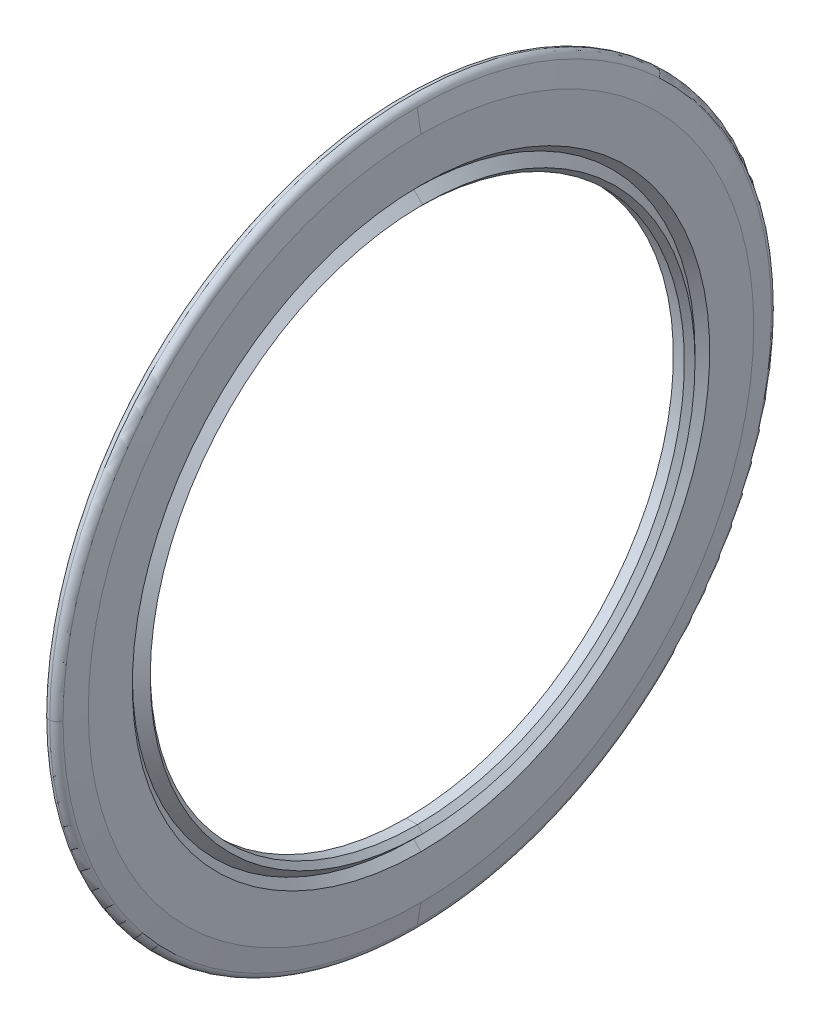
ISO-10303-21;
HEADER;
FILE_DESCRIPTION(('STEP AP214'),'2;1');
FILE_NAME('part.step','',(''),(''),'','','');
FILE_SCHEMA(('AUTOMOTIVE_DESIGN { 1 0 10303 214 1 1 1 1 }'));
ENDSEC;
DATA;
#1=APPLICATION_CONTEXT('core data for automotive mechanical design processes');
#2=APPLICATION_PROTOCOL_DEFINITION('international standard','automotive_design',2000,#1);
#3=PRODUCT_CONTEXT('',#1,'mechanical');
#4=PRODUCT('Part','Part','',(#3));
#5=PRODUCT_RELATED_PRODUCT_CATEGORY('part','',(#4));
#6=PRODUCT_DEFINITION_FORMATION('','',#4);
#7=PRODUCT_DEFINITION_CONTEXT('part definition',#1,'design');
#8=PRODUCT_DEFINITION('design','',#6,#7);
#9=PRODUCT_DEFINITION_SHAPE('','',#8);
#10=(LENGTH_UNIT() NAMED_UNIT(*) SI_UNIT(.MILLI.,.METRE.));
#11=(NAMED_UNIT(*) PLANE_ANGLE_UNIT() SI_UNIT($,.RADIAN.));
#12=(NAMED_UNIT(*) SI_UNIT($,.STERADIAN.) SOLID_ANGLE_UNIT());
#13=UNCERTAINTY_MEASURE_WITH_UNIT(LENGTH_MEASURE(1.E-05),#10,'distance_accuracy_value','');
#14=(GEOMETRIC_REPRESENTATION_CONTEXT(3) GLOBAL_UNCERTAINTY_ASSIGNED_CONTEXT((#13)) GLOBAL_UNIT_ASSIGNED_CONTEXT((#10,
#11,#12)) REPRESENTATION_CONTEXT('',''));
#15=CARTESIAN_POINT('',(0.,0.,0.));
#16=DIRECTION('',(0.,0.,1.));
#17=DIRECTION('',(1.,0.,0.));
#18=AXIS2_PLACEMENT_3D('',#15,#16,#17);
#19=CARTESIAN_POINT('',(0.22,20.7131,0.));
#20=DIRECTION('',(-1.,0.,0.));
#21=DIRECTION('',(0.,0.,1.));
#22=AXIS2_PLACEMENT_3D('',#19,#20,#21);
#23=PLANE('',#22);
#24=CARTESIAN_POINT('',(0.22,0.,0.));
#25=DIRECTION('',(1.,0.,0.));
#26=DIRECTION('',(0.,1.,0.));
#27=AXIS2_PLACEMENT_3D('',#24,#25,#26);
#28=CIRCLE('',#27,20.3051);
#29=CARTESIAN_POINT('',(0.22,20.3051,0.));
#30=VERTEX_POINT('',#29);
#31=CARTESIAN_POINT('',(0.22,-20.3051,0.));
#32=VERTEX_POINT('',#31);
#33=EDGE_CURVE('E11',#30,#32,#28,.T.);
#34=ORIENTED_EDGE('',*,*,#33,.T.);
#35=CARTESIAN_POINT('',(0.22,0.,0.));
#36=DIRECTION('',(1.,0.,0.));
#37=DIRECTION('',(0.,1.,0.));
#38=AXIS2_PLACEMENT_3D('',#35,#36,#37);
#39=CIRCLE('',#38,20.3051);
#40=EDGE_CURVE('E187',#32,#30,#39,.T.);
#41=ORIENTED_EDGE('',*,*,#40,.T.);
#42=EDGE_LOOP('',(#34,#41));
#43=FACE_BOUND('',#42,.T.);
#44=CARTESIAN_POINT('',(0.22,0.,0.));
#45=DIRECTION('',(1.,0.,0.));
#46=DIRECTION('',(0.,1.,0.));
#47=AXIS2_PLACEMENT_3D('',#44,#45,#46);
#48=CIRCLE('',#47,21.1211);
#49=CARTESIAN_POINT('',(0.22,0.,-21.1211));
#50=VERTEX_POINT('',#49);
#51=CARTESIAN_POINT('',(0.22,0.,21.1211));
#52=VERTEX_POINT('',#51);
#53=EDGE_CURVE('E149',#50,#52,#48,.T.);
#54=ORIENTED_EDGE('',*,*,#53,.F.);
#55=CARTESIAN_POINT('',(0.22,0.,0.));
#56=DIRECTION('',(1.,0.,0.));
#57=DIRECTION('',(0.,1.,0.));
#58=AXIS2_PLACEMENT_3D('',#55,#56,#57);
#59=CIRCLE('',#58,21.1211);
#60=EDGE_CURVE('E158',#52,#50,#59,.T.);
#61=ORIENTED_EDGE('',*,*,#60,.F.);
#62=EDGE_LOOP('',(#54,#61));
#63=FACE_BOUND('',#62,.T.);
#64=ADVANCED_FACE('F16',(#43,#63),#23,.T.);
#65=CARTESIAN_POINT('',(0.33,0.,0.));
#66=DIRECTION('',(-1.,0.,0.));
#67=DIRECTION('',(0.,1.,0.));
#68=AXIS2_PLACEMENT_3D('',#65,#66,#67);
#69=CONICAL_SURFACE('',#68,20.1951,0.785398163397453);
#70=DIRECTION('',(0.707106781186544,-0.707106781186551,0.));
#71=VECTOR('',#70,1.);
#72=CARTESIAN_POINT('',(0.33,20.1951,0.));
#73=LINE('',#72,#71);
#74=CARTESIAN_POINT('',(0.44,20.0851,0.));
#75=VERTEX_POINT('',#74);
#76=EDGE_CURVE('E171',#30,#75,#73,.T.);
#77=ORIENTED_EDGE('',*,*,#76,.T.);
#78=CARTESIAN_POINT('',(0.44,0.,0.));
#79=DIRECTION('',(1.,0.,0.));
#80=DIRECTION('',(0.,1.,0.));
#81=AXIS2_PLACEMENT_3D('',#78,#79,#80);
#82=CIRCLE('',#81,20.0851);
#83=CARTESIAN_POINT('',(0.44,-20.0851,0.));
#84=VERTEX_POINT('',#83);
#85=EDGE_CURVE('E19',#75,#84,#82,.T.);
#86=ORIENTED_EDGE('',*,*,#85,.T.);
#87=DIRECTION('',(-0.707106781186544,-0.707106781186551,0.));
#88=VECTOR('',#87,1.);
#89=CARTESIAN_POINT('',(0.33,-20.1951,0.));
#90=LINE('',#89,#88);
#91=EDGE_CURVE('E190',#84,#32,#90,.T.);
#92=ORIENTED_EDGE('',*,*,#91,.T.);
#93=ORIENTED_EDGE('',*,*,#33,.F.);
#94=EDGE_LOOP('',(#77,#86,#92,#93));
#95=FACE_BOUND('',#94,.T.);
#96=ADVANCED_FACE('F277',(#95),#69,.F.);
#97=CARTESIAN_POINT('',(0.44,18.7751,0.));
#98=DIRECTION('',(-1.,0.,0.));
#99=DIRECTION('',(0.,0.,1.));
#100=AXIS2_PLACEMENT_3D('',#97,#98,#99);
#101=PLANE('',#100);
#102=CARTESIAN_POINT('',(0.44,0.,0.));
#103=DIRECTION('',(1.,0.,0.));
#104=DIRECTION('',(0.,1.,0.));
#105=AXIS2_PLACEMENT_3D('',#102,#103,#104);
#106=CIRCLE('',#105,17.4651);
#107=CARTESIAN_POINT('',(0.44,17.4651,0.));
#108=VERTEX_POINT('',#107);
#109=CARTESIAN_POINT('',(0.44,-17.4651,0.));
#110=VERTEX_POINT('',#109);
#111=EDGE_CURVE('E168',#108,#110,#106,.T.);
#112=ORIENTED_EDGE('',*,*,#111,.T.);
#113=CARTESIAN_POINT('',(0.44,0.,0.));
#114=DIRECTION('',(1.,0.,0.));
#115=DIRECTION('',(0.,1.,0.));
#116=AXIS2_PLACEMENT_3D('',#113,#114,#115);
#117=CIRCLE('',#116,17.4651);
#118=EDGE_CURVE('E228',#110,#108,#117,.T.);
#119=ORIENTED_EDGE('',*,*,#118,.T.);
#120=EDGE_LOOP('',(#112,#119));
#121=FACE_BOUND('',#120,.T.);
#122=ORIENTED_EDGE('',*,*,#85,.F.);
#123=CARTESIAN_POINT('',(0.44,0.,0.));
#124=DIRECTION('',(1.,0.,0.));
#125=DIRECTION('',(0.,1.,0.));
#126=AXIS2_PLACEMENT_3D('',#123,#124,#125);
#127=CIRCLE('',#126,20.0851);
#128=EDGE_CURVE('E197',#84,#75,#127,.T.);
#129=ORIENTED_EDGE('',*,*,#128,.F.);
#130=EDGE_LOOP('',(#122,#129));
#131=FACE_BOUND('',#130,.T.);
#132=ADVANCED_FACE('F282',(#121,#131),#101,.T.);
#133=CARTESIAN_POINT('',(0.33,0.,0.));
#134=DIRECTION('',(1.,0.,0.));
#135=DIRECTION('',(0.,1.,0.));
#136=AXIS2_PLACEMENT_3D('',#133,#134,#135);
#137=CONICAL_SURFACE('',#136,17.3551,0.785398163397453);
#138=DIRECTION('',(0.707106781186544,0.707106781186551,0.));
#139=VECTOR('',#138,1.);
#140=CARTESIAN_POINT('',(0.33,17.3551,0.));
#141=LINE('',#140,#139);
#142=CARTESIAN_POINT('',(0.22,17.2451,0.));
#143=VERTEX_POINT('',#142);
#144=EDGE_CURVE('E202',#143,#108,#141,.T.);
#145=ORIENTED_EDGE('',*,*,#144,.T.);
#146=ORIENTED_EDGE('',*,*,#118,.F.);
#147=DIRECTION('',(-0.707106781186544,0.707106781186551,0.));
#148=VECTOR('',#147,1.);
#149=CARTESIAN_POINT('',(0.33,-17.3551,0.));
#150=LINE('',#149,#148);
#151=CARTESIAN_POINT('',(0.22,-17.2451,0.));
#152=VERTEX_POINT('',#151);
#153=EDGE_CURVE('E165',#110,#152,#150,.T.);
#154=ORIENTED_EDGE('',*,*,#153,.T.);
#155=CARTESIAN_POINT('',(0.22,0.,0.));
#156=DIRECTION('',(1.,0.,0.));
#157=DIRECTION('',(0.,1.,0.));
#158=AXIS2_PLACEMENT_3D('',#155,#156,#157);
#159=CIRCLE('',#158,17.2451);
#160=EDGE_CURVE('E226',#152,#143,#159,.T.);
#161=ORIENTED_EDGE('',*,*,#160,.T.);
#162=EDGE_LOOP('',(#145,#146,#154,#161));
#163=FACE_BOUND('',#162,.T.);
#164=ADVANCED_FACE('F295',(#163),#137,.T.);
#165=CARTESIAN_POINT('',(0.22,17.0411,0.));
#166=DIRECTION('',(-1.,0.,0.));
#167=DIRECTION('',(0.,0.,1.));
#168=AXIS2_PLACEMENT_3D('',#165,#166,#167);
#169=PLANE('',#168);
#170=CARTESIAN_POINT('',(0.22,0.,0.));
#171=DIRECTION('',(1.,0.,0.));
#172=DIRECTION('',(0.,1.,0.));
#173=AXIS2_PLACEMENT_3D('',#170,#171,#172);
#174=CIRCLE('',#173,16.8371);
#175=CARTESIAN_POINT('',(0.22,16.8371,0.));
#176=VERTEX_POINT('',#175);
#177=CARTESIAN_POINT('',(0.22,-16.8371,0.));
#178=VERTEX_POINT('',#177);
#179=EDGE_CURVE('E229',#176,#178,#174,.T.);
#180=ORIENTED_EDGE('',*,*,#179,.T.);
#181=CARTESIAN_POINT('',(0.22,0.,0.));
#182=DIRECTION('',(1.,0.,0.));
#183=DIRECTION('',(0.,1.,0.));
#184=AXIS2_PLACEMENT_3D('',#181,#182,#183);
#185=CIRCLE('',#184,16.8371);
#186=EDGE_CURVE('E191',#178,#176,#185,.T.);
#187=ORIENTED_EDGE('',*,*,#186,.T.);
#188=EDGE_LOOP('',(#180,#187));
#189=FACE_BOUND('',#188,.T.);
#190=CARTESIAN_POINT('',(0.22,0.,0.));
#191=DIRECTION('',(1.,0.,0.));
#192=DIRECTION('',(0.,1.,0.));
#193=AXIS2_PLACEMENT_3D('',#190,#191,#192);
#194=CIRCLE('',#193,17.2451);
#195=EDGE_CURVE('E169',#143,#152,#194,.T.);
#196=ORIENTED_EDGE('',*,*,#195,.F.);
#197=ORIENTED_EDGE('',*,*,#160,.F.);
#198=EDGE_LOOP('',(#196,#197));
#199=FACE_BOUND('',#198,.T.);
#200=ADVANCED_FACE('F300',(#189,#199),#169,.T.);
#201=CARTESIAN_POINT('',(0.488275,0.,0.));
#202=DIRECTION('',(-1.,0.,0.));
#203=DIRECTION('',(0.,1.,0.));
#204=AXIS2_PLACEMENT_3D('',#201,#202,#203);
#205=CONICAL_SURFACE('',#204,16.568825,0.785398163397449);
#206=DIRECTION('',(0.707106781186547,-0.707106781186548,0.));
#207=VECTOR('',#206,1.);
#208=CARTESIAN_POINT('',(0.488275,16.568825,0.));
#209=LINE('',#208,#207);
#210=CARTESIAN_POINT('',(0.75655,16.30055,0.));
#211=VERTEX_POINT('',#210);
#212=EDGE_CURVE('E178',#176,#211,#209,.T.);
#213=ORIENTED_EDGE('',*,*,#212,.T.);
#214=CARTESIAN_POINT('',(0.75655,0.,0.));
#215=DIRECTION('',(1.,0.,0.));
#216=DIRECTION('',(0.,1.,0.));
#217=AXIS2_PLACEMENT_3D('',#214,#215,#216);
#218=CIRCLE('',#217,16.30055);
#219=CARTESIAN_POINT('',(0.75655,-16.30055,0.));
#220=VERTEX_POINT('',#219);
#221=EDGE_CURVE('E223',#211,#220,#218,.T.);
#222=ORIENTED_EDGE('',*,*,#221,.T.);
#223=DIRECTION('',(-0.707106781186547,-0.707106781186548,0.));
#224=VECTOR('',#223,1.);
#225=CARTESIAN_POINT('',(0.488275,-16.568825,0.));
#226=LINE('',#225,#224);
#227=EDGE_CURVE('E194',#220,#178,#226,.T.);
#228=ORIENTED_EDGE('',*,*,#227,.T.);
#229=ORIENTED_EDGE('',*,*,#179,.F.);
#230=EDGE_LOOP('',(#213,#222,#228,#229));
#231=FACE_BOUND('',#230,.T.);
#232=ADVANCED_FACE('F304',(#231),#205,.F.);
#233=CARTESIAN_POINT('',(0.598275,0.,0.));
#234=DIRECTION('',(1.,0.,0.));
#235=DIRECTION('',(0.,1.,0.));
#236=AXIS2_PLACEMENT_3D('',#233,#234,#235);
#237=CONICAL_SURFACE('',#236,16.142275,0.785398163397449);
#238=DIRECTION('',(0.707106781186547,0.707106781186548,0.));
#239=VECTOR('',#238,1.);
#240=CARTESIAN_POINT('',(0.598275,16.142275,0.));
#241=LINE('',#240,#239);
#242=CARTESIAN_POINT('',(0.44,15.984,0.));
#243=VERTEX_POINT('',#242);
#244=EDGE_CURVE('E214',#243,#211,#241,.T.);
#245=ORIENTED_EDGE('',*,*,#244,.T.);
#246=CARTESIAN_POINT('',(0.75655,0.,0.));
#247=DIRECTION('',(1.,0.,0.));
#248=DIRECTION('',(0.,1.,0.));
#249=AXIS2_PLACEMENT_3D('',#246,#247,#248);
#250=CIRCLE('',#249,16.30055);
#251=EDGE_CURVE('E211',#220,#211,#250,.T.);
#252=ORIENTED_EDGE('',*,*,#251,.F.);
#253=DIRECTION('',(-0.707106781186547,0.707106781186548,0.));
#254=VECTOR('',#253,1.);
#255=CARTESIAN_POINT('',(0.598275,-16.142275,0.));
#256=LINE('',#255,#254);
#257=CARTESIAN_POINT('',(0.44,-15.984,0.));
#258=VERTEX_POINT('',#257);
#259=EDGE_CURVE('E220',#220,#258,#256,.T.);
#260=ORIENTED_EDGE('',*,*,#259,.T.);
#261=CARTESIAN_POINT('',(0.44,0.,0.));
#262=DIRECTION('',(1.,0.,0.));
#263=DIRECTION('',(0.,1.,0.));
#264=AXIS2_PLACEMENT_3D('',#261,#262,#263);
#265=CIRCLE('',#264,15.984);
#266=EDGE_CURVE('E232',#258,#243,#265,.T.);
#267=ORIENTED_EDGE('',*,*,#266,.T.);
#268=EDGE_LOOP('',(#245,#252,#260,#267));
#269=FACE_BOUND('',#268,.T.);
#270=ADVANCED_FACE('F308',(#269),#237,.T.);
#271=CARTESIAN_POINT('',(0.77,0.,0.));
#272=DIRECTION('',(1.,0.,0.));
#273=DIRECTION('',(0.,1.,0.));
#274=AXIS2_PLACEMENT_3D('',#271,#272,#273);
#275=CYLINDRICAL_SURFACE('',#274,15.984);
#276=DIRECTION('',(1.,0.,0.));
#277=VECTOR('',#276,1.);
#278=CARTESIAN_POINT('',(0.77,15.984,0.));
#279=LINE('',#278,#277);
#280=CARTESIAN_POINT('',(1.1,15.984,0.));
#281=VERTEX_POINT('',#280);
#282=EDGE_CURVE('E225',#243,#281,#279,.T.);
#283=ORIENTED_EDGE('',*,*,#282,.T.);
#284=CARTESIAN_POINT('',(1.1,0.,0.));
#285=DIRECTION('',(1.,0.,0.));
#286=DIRECTION('',(0.,1.,0.));
#287=AXIS2_PLACEMENT_3D('',#284,#285,#286);
#288=CIRCLE('',#287,15.984);
#289=CARTESIAN_POINT('',(1.1,-15.984,0.));
#290=VERTEX_POINT('',#289);
#291=EDGE_CURVE('E271',#281,#290,#288,.T.);
#292=ORIENTED_EDGE('',*,*,#291,.T.);
#293=DIRECTION('',(-1.,0.,0.));
#294=VECTOR('',#293,1.);
#295=CARTESIAN_POINT('',(0.77,-15.984,0.));
#296=LINE('',#295,#294);
#297=EDGE_CURVE('E234',#290,#258,#296,.T.);
#298=ORIENTED_EDGE('',*,*,#297,.T.);
#299=CARTESIAN_POINT('',(0.44,0.,0.));
#300=DIRECTION('',(1.,0.,0.));
#301=DIRECTION('',(0.,1.,0.));
#302=AXIS2_PLACEMENT_3D('',#299,#300,#301);
#303=CIRCLE('',#302,15.984);
#304=EDGE_CURVE('E217',#243,#258,#303,.T.);
#305=ORIENTED_EDGE('',*,*,#304,.F.);
#306=EDGE_LOOP('',(#283,#292,#298,#305));
#307=FACE_BOUND('',#306,.T.);
#308=ADVANCED_FACE('F312',(#307),#275,.F.);
#309=CARTESIAN_POINT('',(1.258275,0.,0.));
#310=DIRECTION('',(1.,0.,0.));
#311=DIRECTION('',(0.,1.,0.));
#312=AXIS2_PLACEMENT_3D('',#309,#310,#311);
#313=CONICAL_SURFACE('',#312,16.142275,0.785398163397443);
#314=DIRECTION('',(0.707106781186551,0.707106781186544,0.));
#315=VECTOR('',#314,1.);
#316=CARTESIAN_POINT('',(1.258275,16.142275,0.));
#317=LINE('',#316,#315);
#318=CARTESIAN_POINT('',(1.41655,16.30055,0.));
#319=VERTEX_POINT('',#318);
#320=EDGE_CURVE('E239',#281,#319,#317,.T.);
#321=ORIENTED_EDGE('',*,*,#320,.T.);
#322=CARTESIAN_POINT('',(1.41655,0.,0.));
#323=DIRECTION('',(1.,0.,0.));
#324=DIRECTION('',(0.,1.,0.));
#325=AXIS2_PLACEMENT_3D('',#322,#323,#324);
#326=CIRCLE('',#325,16.30055);
#327=CARTESIAN_POINT('',(1.41655,-16.30055,0.));
#328=VERTEX_POINT('',#327);
#329=EDGE_CURVE('E179',#319,#328,#326,.T.);
#330=ORIENTED_EDGE('',*,*,#329,.T.);
#331=DIRECTION('',(-0.707106781186551,0.707106781186544,0.));
#332=VECTOR('',#331,1.);
#333=CARTESIAN_POINT('',(1.258275,-16.142275,0.));
#334=LINE('',#333,#332);
#335=EDGE_CURVE('E242',#328,#290,#334,.T.);
#336=ORIENTED_EDGE('',*,*,#335,.T.);
#337=ORIENTED_EDGE('',*,*,#291,.F.);
#338=EDGE_LOOP('',(#321,#330,#336,#337));
#339=FACE_BOUND('',#338,.T.);
#340=ADVANCED_FACE('F316',(#339),#313,.F.);
#341=CARTESIAN_POINT('',(1.148275,0.,0.));
#342=DIRECTION('',(-1.,0.,0.));
#343=DIRECTION('',(0.,1.,0.));
#344=AXIS2_PLACEMENT_3D('',#341,#342,#343);
#345=CONICAL_SURFACE('',#344,16.568825,0.785398163397452);
#346=DIRECTION('',(0.707106781186545,-0.70710678118655,0.));
#347=VECTOR('',#346,1.);
#348=CARTESIAN_POINT('',(1.148275,16.568825,0.));
#349=LINE('',#348,#347);
#350=CARTESIAN_POINT('',(0.88,16.8371,0.));
#351=VERTEX_POINT('',#350);
#352=EDGE_CURVE('E248',#351,#319,#349,.T.);
#353=ORIENTED_EDGE('',*,*,#352,.T.);
#354=CARTESIAN_POINT('',(1.41655,0.,0.));
#355=DIRECTION('',(1.,0.,0.));
#356=DIRECTION('',(0.,1.,0.));
#357=AXIS2_PLACEMENT_3D('',#354,#355,#356);
#358=CIRCLE('',#357,16.30055);
#359=EDGE_CURVE('E245',#328,#319,#358,.T.);
#360=ORIENTED_EDGE('',*,*,#359,.F.);
#361=DIRECTION('',(-0.707106781186545,-0.70710678118655,0.));
#362=VECTOR('',#361,1.);
#363=CARTESIAN_POINT('',(1.148275,-16.568825,0.));
#364=LINE('',#363,#362);
#365=CARTESIAN_POINT('',(0.88,-16.8371,0.));
#366=VERTEX_POINT('',#365);
#367=EDGE_CURVE('E182',#328,#366,#364,.T.);
#368=ORIENTED_EDGE('',*,*,#367,.T.);
#369=CARTESIAN_POINT('',(0.88,0.,0.));
#370=DIRECTION('',(1.,0.,0.));
#371=DIRECTION('',(0.,1.,0.));
#372=AXIS2_PLACEMENT_3D('',#369,#370,#371);
#373=CIRCLE('',#372,16.8371);
#374=EDGE_CURVE('E174',#366,#351,#373,.T.);
#375=ORIENTED_EDGE('',*,*,#374,.T.);
#376=EDGE_LOOP('',(#353,#360,#368,#375));
#377=FACE_BOUND('',#376,.T.);
#378=ADVANCED_FACE('F320',(#377),#345,.T.);
#379=CARTESIAN_POINT('',(1.1,0.,0.));
#380=DIRECTION('',(1.,0.,0.));
#381=DIRECTION('',(0.,1.,0.));
#382=AXIS2_PLACEMENT_3D('',#379,#380,#381);
#383=CONICAL_SURFACE('',#382,17.0571,0.785398163397445);
#384=DIRECTION('',(0.70710678118655,0.707106781186545,0.));
#385=VECTOR('',#384,1.);
#386=CARTESIAN_POINT('',(1.1,17.0571,0.));
#387=LINE('',#386,#385);
#388=CARTESIAN_POINT('',(1.32,17.2771,0.));
#389=VERTEX_POINT('',#388);
#390=EDGE_CURVE('E181',#351,#389,#387,.T.);
#391=ORIENTED_EDGE('',*,*,#390,.T.);
#392=CARTESIAN_POINT('',(1.32,0.,0.));
#393=DIRECTION('',(1.,0.,0.));
#394=DIRECTION('',(0.,1.,0.));
#395=AXIS2_PLACEMENT_3D('',#392,#393,#394);
#396=CIRCLE('',#395,17.2771);
#397=CARTESIAN_POINT('',(1.32,-17.2771,0.));
#398=VERTEX_POINT('',#397);
#399=EDGE_CURVE('E164',#389,#398,#396,.T.);
#400=ORIENTED_EDGE('',*,*,#399,.T.);
#401=DIRECTION('',(-0.70710678118655,0.707106781186545,0.));
#402=VECTOR('',#401,1.);
#403=CARTESIAN_POINT('',(1.1,-17.0571,0.));
#404=LINE('',#403,#402);
#405=EDGE_CURVE('E172',#398,#366,#404,.T.);
#406=ORIENTED_EDGE('',*,*,#405,.T.);
#407=CARTESIAN_POINT('',(0.88,0.,0.));
#408=DIRECTION('',(1.,0.,0.));
#409=DIRECTION('',(0.,1.,0.));
#410=AXIS2_PLACEMENT_3D('',#407,#408,#409);
#411=CIRCLE('',#410,16.8371);
#412=EDGE_CURVE('E251',#351,#366,#411,.T.);
#413=ORIENTED_EDGE('',*,*,#412,.F.);
#414=EDGE_LOOP('',(#391,#400,#406,#413));
#415=FACE_BOUND('',#414,.T.);
#416=ADVANCED_FACE('F324',(#415),#383,.F.);
#417=CARTESIAN_POINT('',(1.32,18.5945065058178,0.));
#418=DIRECTION('',(1.,0.,0.));
#419=DIRECTION('',(0.,1.,0.));
#420=AXIS2_PLACEMENT_3D('',#417,#418,#419);
#421=PLANE('',#420);
#422=ORIENTED_EDGE('',*,*,#399,.F.);
#423=CARTESIAN_POINT('',(1.32,0.,0.));
#424=DIRECTION('',(1.,0.,0.));
#425=DIRECTION('',(0.,1.,0.));
#426=AXIS2_PLACEMENT_3D('',#423,#424,#425);
#427=CIRCLE('',#426,17.2771);
#428=EDGE_CURVE('E173',#398,#389,#427,.T.);
#429=ORIENTED_EDGE('',*,*,#428,.F.);
#430=EDGE_LOOP('',(#422,#429));
#431=FACE_BOUND('',#430,.T.);
#432=CARTESIAN_POINT('',(1.32,0.,0.));
#433=DIRECTION('',(1.,0.,0.));
#434=DIRECTION('',(0.,1.,0.));
#435=AXIS2_PLACEMENT_3D('',#432,#433,#434);
#436=CIRCLE('',#435,19.9119130116355);
#437=CARTESIAN_POINT('',(1.32,19.9119130116355,0.));
#438=VERTEX_POINT('',#437);
#439=CARTESIAN_POINT('',(1.32,-19.9119130116355,0.));
#440=VERTEX_POINT('',#439);
#441=EDGE_CURVE('E138',#438,#440,#436,.T.);
#442=ORIENTED_EDGE('',*,*,#441,.T.);
#443=CARTESIAN_POINT('',(1.32,0.,0.));
#444=DIRECTION('',(1.,0.,0.));
#445=DIRECTION('',(0.,1.,0.));
#446=AXIS2_PLACEMENT_3D('',#443,#444,#445);
#447=CIRCLE('',#446,19.9119130116355);
#448=EDGE_CURVE('E37',#440,#438,#447,.T.);
#449=ORIENTED_EDGE('',*,*,#448,.T.);
#450=EDGE_LOOP('',(#442,#449));
#451=FACE_BOUND('',#450,.T.);
#452=ADVANCED_FACE('F329',(#431,#451),#421,.T.);
#453=CARTESIAN_POINT('',(1.20665770566269,0.,0.));
#454=DIRECTION('',(-1.,0.,0.));
#455=DIRECTION('',(0.,1.,0.));
#456=AXIS2_PLACEMENT_3D('',#453,#454,#455);
#457=CONICAL_SURFACE('',#456,20.5547091049045,1.39626340159546);
#458=DIRECTION('',(0.173648177666931,-0.984807753012208,0.));
#459=VECTOR('',#458,1.);
#460=CARTESIAN_POINT('',(1.20665770566269,20.5547091049045,0.));
#461=LINE('',#460,#459);
#462=CARTESIAN_POINT('',(1.09331541132537,21.1975051981734,0.));
#463=VERTEX_POINT('',#462);
#464=EDGE_CURVE('E261',#463,#438,#461,.T.);
#465=ORIENTED_EDGE('',*,*,#464,.T.);
#466=ORIENTED_EDGE('',*,*,#448,.F.);
#467=DIRECTION('',(-0.173648177666931,-0.984807753012208,0.));
#468=VECTOR('',#467,1.);
#469=CARTESIAN_POINT('',(1.20665770566269,-20.5547091049045,0.));
#470=LINE('',#469,#468);
#471=CARTESIAN_POINT('',(1.09331541132537,-21.1975051981734,0.));
#472=VERTEX_POINT('',#471);
#473=EDGE_CURVE('E199',#440,#472,#470,.T.);
#474=ORIENTED_EDGE('',*,*,#473,.T.);
#475=CARTESIAN_POINT('',(1.09331541132537,0.,0.));
#476=DIRECTION('',(1.,0.,0.));
#477=DIRECTION('',(0.,1.,0.));
#478=AXIS2_PLACEMENT_3D('',#475,#476,#477);
#479=CIRCLE('',#478,21.1975051981734);
#480=CARTESIAN_POINT('',(1.09331541132537,0.,-21.1975051981734));
#481=VERTEX_POINT('',#480);
#482=EDGE_CURVE('E31',#472,#481,#479,.T.);
#483=ORIENTED_EDGE('',*,*,#482,.T.);
#484=CARTESIAN_POINT('',(1.09331541132537,0.,0.));
#485=DIRECTION('',(1.,0.,0.));
#486=DIRECTION('',(0.,1.,0.));
#487=AXIS2_PLACEMENT_3D('',#484,#485,#486);
#488=CIRCLE('',#487,21.1975051981734);
#489=EDGE_CURVE('E137',#481,#463,#488,.T.);
#490=ORIENTED_EDGE('',*,*,#489,.T.);
#491=EDGE_LOOP('',(#465,#466,#474,#483,#490));
#492=FACE_BOUND('',#491,.T.);
#493=ADVANCED_FACE('F326',(#492),#457,.T.);
#494=CARTESIAN_POINT('',(0.66,0.,0.));
#495=DIRECTION('',(1.,0.,0.));
#496=DIRECTION('',(0.,0.,-1.));
#497=AXIS2_PLACEMENT_3D('',#494,#495,#496);
#498=TOROIDAL_SURFACE('',#497,21.1211,0.44);
#499=CARTESIAN_POINT('',(0.66,0.,0.));
#500=DIRECTION('',(1.,0.,0.));
#501=DIRECTION('',(0.,0.,-1.));
#502=AXIS2_PLACEMENT_3D('',#499,#500,#501);
#503=CIRCLE('',#502,21.5611);
#504=CARTESIAN_POINT('',(0.66,0.,21.5611));
#505=VERTEX_POINT('',#504);
#506=CARTESIAN_POINT('',(0.66,0.,-21.5611));
#507=VERTEX_POINT('',#506);
#508=EDGE_CURVE('E131',#505,#507,#503,.T.);
#509=ORIENTED_EDGE('',*,*,#508,.T.);
#510=CARTESIAN_POINT('',(0.66,0.,-21.1211));
#511=DIRECTION('',(0.,-1.,0.));
#512=DIRECTION('',(0.,0.,-1.));
#513=AXIS2_PLACEMENT_3D('',#510,#511,#512);
#514=CIRCLE('',#513,0.44);
#515=EDGE_CURVE('E145',#507,#481,#514,.T.);
#516=ORIENTED_EDGE('',*,*,#515,.T.);
#517=ORIENTED_EDGE('',*,*,#482,.F.);
#518=CARTESIAN_POINT('',(1.09331541132537,0.,0.));
#519=DIRECTION('',(1.,0.,0.));
#520=DIRECTION('',(0.,1.,0.));
#521=AXIS2_PLACEMENT_3D('',#518,#519,#520);
#522=CIRCLE('',#521,21.1975051981734);
#523=CARTESIAN_POINT('',(1.09331541132537,0.,21.1975051981734));
#524=VERTEX_POINT('',#523);
#525=EDGE_CURVE('E133',#524,#472,#522,.T.);
#526=ORIENTED_EDGE('',*,*,#525,.F.);
#527=CARTESIAN_POINT('',(0.66,0.,21.1211));
#528=DIRECTION('',(0.,-1.,0.));
#529=DIRECTION('',(0.,0.,1.));
#530=AXIS2_PLACEMENT_3D('',#527,#528,#529);
#531=CIRCLE('',#530,0.44);
#532=EDGE_CURVE('E127',#524,#505,#531,.T.);
#533=ORIENTED_EDGE('',*,*,#532,.T.);
#534=EDGE_LOOP('',(#509,#516,#517,#526,#533));
#535=FACE_BOUND('',#534,.T.);
#536=ADVANCED_FACE('F129',(#535),#498,.T.);
#537=CARTESIAN_POINT('',(0.66,0.,0.));
#538=DIRECTION('',(1.,0.,0.));
#539=DIRECTION('',(0.,0.,-1.));
#540=AXIS2_PLACEMENT_3D('',#537,#538,#539);
#541=TOROIDAL_SURFACE('',#540,21.1211,0.44);
#542=CARTESIAN_POINT('',(0.66,0.,0.));
#543=DIRECTION('',(1.,0.,0.));
#544=DIRECTION('',(0.,0.,-1.));
#545=AXIS2_PLACEMENT_3D('',#542,#543,#544);
#546=CIRCLE('',#545,21.5611);
#547=EDGE_CURVE('E141',#507,#505,#546,.T.);
#548=ORIENTED_EDGE('',*,*,#547,.T.);
#549=ORIENTED_EDGE('',*,*,#532,.F.);
#550=CARTESIAN_POINT('',(1.09331541132537,0.,0.));
#551=DIRECTION('',(1.,0.,0.));
#552=DIRECTION('',(0.,1.,0.));
#553=AXIS2_PLACEMENT_3D('',#550,#551,#552);
#554=CIRCLE('',#553,21.1975051981734);
#555=EDGE_CURVE('E263',#463,#524,#554,.T.);
#556=ORIENTED_EDGE('',*,*,#555,.F.);
#557=ORIENTED_EDGE('',*,*,#489,.F.);
#558=ORIENTED_EDGE('',*,*,#515,.F.);
#559=EDGE_LOOP('',(#548,#549,#556,#557,#558));
#560=FACE_BOUND('',#559,.T.);
#561=ADVANCED_FACE('F143',(#560),#541,.T.);
#562=CARTESIAN_POINT('',(1.20665770566269,0.,0.));
#563=DIRECTION('',(-1.,0.,0.));
#564=DIRECTION('',(0.,1.,0.));
#565=AXIS2_PLACEMENT_3D('',#562,#563,#564);
#566=CONICAL_SURFACE('',#565,20.5547091049045,1.39626340159546);
#567=ORIENTED_EDGE('',*,*,#464,.F.);
#568=ORIENTED_EDGE('',*,*,#555,.T.);
#569=ORIENTED_EDGE('',*,*,#525,.T.);
#570=ORIENTED_EDGE('',*,*,#473,.F.);
#571=ORIENTED_EDGE('',*,*,#441,.F.);
#572=EDGE_LOOP('',(#567,#568,#569,#570,#571));
#573=FACE_BOUND('',#572,.T.);
#574=ADVANCED_FACE('F332',(#573),#566,.T.);
#575=CARTESIAN_POINT('',(1.1,0.,0.));
#576=DIRECTION('',(1.,0.,0.));
#577=DIRECTION('',(0.,1.,0.));
#578=AXIS2_PLACEMENT_3D('',#575,#576,#577);
#579=CONICAL_SURFACE('',#578,17.0571,0.785398163397445);
#580=ORIENTED_EDGE('',*,*,#390,.F.);
#581=ORIENTED_EDGE('',*,*,#374,.F.);
#582=ORIENTED_EDGE('',*,*,#405,.F.);
#583=ORIENTED_EDGE('',*,*,#428,.T.);
#584=EDGE_LOOP('',(#580,#581,#582,#583));
#585=FACE_BOUND('',#584,.T.);
#586=ADVANCED_FACE('F333',(#585),#579,.F.);
#587=CARTESIAN_POINT('',(1.148275,0.,0.));
#588=DIRECTION('',(-1.,0.,0.));
#589=DIRECTION('',(0.,1.,0.));
#590=AXIS2_PLACEMENT_3D('',#587,#588,#589);
#591=CONICAL_SURFACE('',#590,16.568825,0.785398163397452);
#592=ORIENTED_EDGE('',*,*,#352,.F.);
#593=ORIENTED_EDGE('',*,*,#412,.T.);
#594=ORIENTED_EDGE('',*,*,#367,.F.);
#595=ORIENTED_EDGE('',*,*,#329,.F.);
#596=EDGE_LOOP('',(#592,#593,#594,#595));
#597=FACE_BOUND('',#596,.T.);
#598=ADVANCED_FACE('F336',(#597),#591,.T.);
#599=CARTESIAN_POINT('',(1.258275,0.,0.));
#600=DIRECTION('',(1.,0.,0.));
#601=DIRECTION('',(0.,1.,0.));
#602=AXIS2_PLACEMENT_3D('',#599,#600,#601);
#603=CONICAL_SURFACE('',#602,16.142275,0.785398163397443);
#604=ORIENTED_EDGE('',*,*,#320,.F.);
#605=CARTESIAN_POINT('',(1.1,0.,0.));
#606=DIRECTION('',(1.,0.,0.));
#607=DIRECTION('',(0.,1.,0.));
#608=AXIS2_PLACEMENT_3D('',#605,#606,#607);
#609=CIRCLE('',#608,15.984);
#610=EDGE_CURVE('E235',#290,#281,#609,.T.);
#611=ORIENTED_EDGE('',*,*,#610,.F.);
#612=ORIENTED_EDGE('',*,*,#335,.F.);
#613=ORIENTED_EDGE('',*,*,#359,.T.);
#614=EDGE_LOOP('',(#604,#611,#612,#613));
#615=FACE_BOUND('',#614,.T.);
#616=ADVANCED_FACE('F343',(#615),#603,.F.);
#617=CARTESIAN_POINT('',(0.77,0.,0.));
#618=DIRECTION('',(1.,0.,0.));
#619=DIRECTION('',(0.,1.,0.));
#620=AXIS2_PLACEMENT_3D('',#617,#618,#619);
#621=CYLINDRICAL_SURFACE('',#620,15.984);
#622=ORIENTED_EDGE('',*,*,#282,.F.);
#623=ORIENTED_EDGE('',*,*,#266,.F.);
#624=ORIENTED_EDGE('',*,*,#297,.F.);
#625=ORIENTED_EDGE('',*,*,#610,.T.);
#626=EDGE_LOOP('',(#622,#623,#624,#625));
#627=FACE_BOUND('',#626,.T.);
#628=ADVANCED_FACE('F363',(#627),#621,.F.);
#629=CARTESIAN_POINT('',(0.598275,0.,0.));
#630=DIRECTION('',(1.,0.,0.));
#631=DIRECTION('',(0.,1.,0.));
#632=AXIS2_PLACEMENT_3D('',#629,#630,#631);
#633=CONICAL_SURFACE('',#632,16.142275,0.785398163397449);
#634=ORIENTED_EDGE('',*,*,#244,.F.);
#635=ORIENTED_EDGE('',*,*,#304,.T.);
#636=ORIENTED_EDGE('',*,*,#259,.F.);
#637=ORIENTED_EDGE('',*,*,#221,.F.);
#638=EDGE_LOOP('',(#634,#635,#636,#637));
#639=FACE_BOUND('',#638,.T.);
#640=ADVANCED_FACE('F349',(#639),#633,.T.);
#641=CARTESIAN_POINT('',(0.488275,0.,0.));
#642=DIRECTION('',(-1.,0.,0.));
#643=DIRECTION('',(0.,1.,0.));
#644=AXIS2_PLACEMENT_3D('',#641,#642,#643);
#645=CONICAL_SURFACE('',#644,16.568825,0.785398163397449);
#646=ORIENTED_EDGE('',*,*,#212,.F.);
#647=ORIENTED_EDGE('',*,*,#186,.F.);
#648=ORIENTED_EDGE('',*,*,#227,.F.);
#649=ORIENTED_EDGE('',*,*,#251,.T.);
#650=EDGE_LOOP('',(#646,#647,#648,#649));
#651=FACE_BOUND('',#650,.T.);
#652=ADVANCED_FACE('F345',(#651),#645,.F.);
#653=CARTESIAN_POINT('',(0.33,0.,0.));
#654=DIRECTION('',(1.,0.,0.));
#655=DIRECTION('',(0.,1.,0.));
#656=AXIS2_PLACEMENT_3D('',#653,#654,#655);
#657=CONICAL_SURFACE('',#656,17.3551,0.785398163397453);
#658=ORIENTED_EDGE('',*,*,#144,.F.);
#659=ORIENTED_EDGE('',*,*,#195,.T.);
#660=ORIENTED_EDGE('',*,*,#153,.F.);
#661=ORIENTED_EDGE('',*,*,#111,.F.);
#662=EDGE_LOOP('',(#658,#659,#660,#661));
#663=FACE_BOUND('',#662,.T.);
#664=ADVANCED_FACE('F348',(#663),#657,.T.);
#665=CARTESIAN_POINT('',(0.33,0.,0.));
#666=DIRECTION('',(-1.,0.,0.));
#667=DIRECTION('',(0.,1.,0.));
#668=AXIS2_PLACEMENT_3D('',#665,#666,#667);
#669=CONICAL_SURFACE('',#668,20.1951,0.785398163397453);
#670=ORIENTED_EDGE('',*,*,#76,.F.);
#671=ORIENTED_EDGE('',*,*,#40,.F.);
#672=ORIENTED_EDGE('',*,*,#91,.F.);
#673=ORIENTED_EDGE('',*,*,#128,.T.);
#674=EDGE_LOOP('',(#670,#671,#672,#673));
#675=FACE_BOUND('',#674,.T.);
#676=ADVANCED_FACE('F284',(#675),#669,.F.);
#677=CARTESIAN_POINT('',(0.66,0.,0.));
#678=DIRECTION('',(1.,0.,0.));
#679=DIRECTION('',(0.,0.,-1.));
#680=AXIS2_PLACEMENT_3D('',#677,#678,#679);
#681=TOROIDAL_SURFACE('',#680,21.1211,0.44);
#682=ORIENTED_EDGE('',*,*,#547,.F.);
#683=CARTESIAN_POINT('',(0.66,0.,-21.1211));
#684=DIRECTION('',(0.,-1.,0.));
#685=DIRECTION('',(0.,0.,-1.));
#686=AXIS2_PLACEMENT_3D('',#683,#684,#685);
#687=CIRCLE('',#686,0.44);
#688=EDGE_CURVE('E150',#50,#507,#687,.T.);
#689=ORIENTED_EDGE('',*,*,#688,.F.);
#690=ORIENTED_EDGE('',*,*,#53,.T.);
#691=CARTESIAN_POINT('',(0.66,0.,21.1211));
#692=DIRECTION('',(0.,-1.,0.));
#693=DIRECTION('',(0.,0.,1.));
#694=AXIS2_PLACEMENT_3D('',#691,#692,#693);
#695=CIRCLE('',#694,0.44);
#696=EDGE_CURVE('E153',#505,#52,#695,.T.);
#697=ORIENTED_EDGE('',*,*,#696,.F.);
#698=EDGE_LOOP('',(#682,#689,#690,#697));
#699=FACE_BOUND('',#698,.T.);
#700=ADVANCED_FACE('F154',(#699),#681,.T.);
#701=CARTESIAN_POINT('',(0.66,0.,0.));
#702=DIRECTION('',(1.,0.,0.));
#703=DIRECTION('',(0.,0.,-1.));
#704=AXIS2_PLACEMENT_3D('',#701,#702,#703);
#705=TOROIDAL_SURFACE('',#704,21.1211,0.44);
#706=ORIENTED_EDGE('',*,*,#508,.F.);
#707=ORIENTED_EDGE('',*,*,#696,.T.);
#708=ORIENTED_EDGE('',*,*,#60,.T.);
#709=ORIENTED_EDGE('',*,*,#688,.T.);
#710=EDGE_LOOP('',(#706,#707,#708,#709));
#711=FACE_BOUND('',#710,.T.);
#712=ADVANCED_FACE('F160',(#711),#705,.T.);
#713=CLOSED_SHELL('',(#64,#96,#132,#164,#200,#232,#270,#308,#340,#378,#416,#452,#493,#536,#561,
#574,#586,#598,#616,#628,#640,#652,#664,#676,#700,#712));
#714=MANIFOLD_SOLID_BREP('B1',#713);
#715=ADVANCED_BREP_SHAPE_REPRESENTATION('',(#18,#714),#14);
#716=SHAPE_DEFINITION_REPRESENTATION(#9,#715);
ENDSEC;
END-ISO-10303-21;
